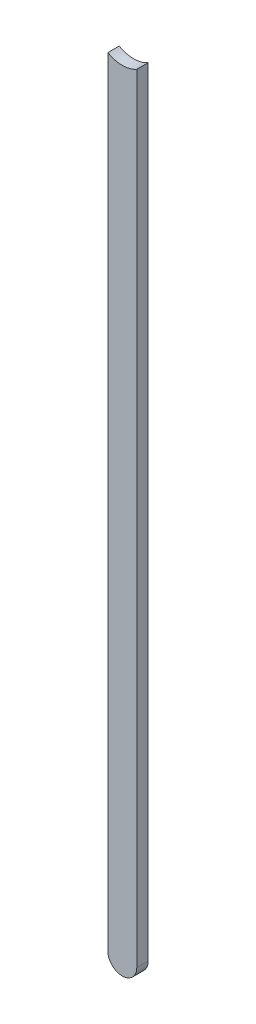
ISO-10303-21;
HEADER;
FILE_DESCRIPTION(('STEP AP214'),'2;1');
FILE_NAME('part.step','',(''),(''),'','','');
FILE_SCHEMA(('AUTOMOTIVE_DESIGN { 1 0 10303 214 1 1 1 1 }'));
ENDSEC;
DATA;
#1=APPLICATION_CONTEXT('core data for automotive mechanical design processes');
#2=APPLICATION_PROTOCOL_DEFINITION('international standard','automotive_design',2000,#1);
#3=PRODUCT_CONTEXT('',#1,'mechanical');
#4=PRODUCT('Part','Part','',(#3));
#5=PRODUCT_RELATED_PRODUCT_CATEGORY('part','',(#4));
#6=PRODUCT_DEFINITION_FORMATION('','',#4);
#7=PRODUCT_DEFINITION_CONTEXT('part definition',#1,'design');
#8=PRODUCT_DEFINITION('design','',#6,#7);
#9=PRODUCT_DEFINITION_SHAPE('','',#8);
#10=(LENGTH_UNIT() NAMED_UNIT(*) SI_UNIT(.MILLI.,.METRE.));
#11=(NAMED_UNIT(*) PLANE_ANGLE_UNIT() SI_UNIT($,.RADIAN.));
#12=(NAMED_UNIT(*) SI_UNIT($,.STERADIAN.) SOLID_ANGLE_UNIT());
#13=UNCERTAINTY_MEASURE_WITH_UNIT(LENGTH_MEASURE(1.E-05),#10,'distance_accuracy_value','');
#14=(GEOMETRIC_REPRESENTATION_CONTEXT(3) GLOBAL_UNCERTAINTY_ASSIGNED_CONTEXT((#13)) GLOBAL_UNIT_ASSIGNED_CONTEXT((#10,
#11,#12)) REPRESENTATION_CONTEXT('',''));
#15=CARTESIAN_POINT('',(0.,0.,0.));
#16=DIRECTION('',(0.,0.,1.));
#17=DIRECTION('',(1.,0.,0.));
#18=AXIS2_PLACEMENT_3D('',#15,#16,#17);
#19=CARTESIAN_POINT('',(99.441,103.8830028,0.));
#20=DIRECTION('',(-1.,0.,0.));
#21=DIRECTION('',(0.,1.,0.));
#22=AXIS2_PLACEMENT_3D('',#19,#20,#21);
#23=PLANE('',#22);
#24=DIRECTION('',(0.,1.,0.));
#25=VECTOR('',#24,1.);
#26=CARTESIAN_POINT('',(99.441,103.8830028,0.1999996));
#27=LINE('',#26,#25);
#28=CARTESIAN_POINT('',(99.441,103.8830028,0.1999996));
#29=VERTEX_POINT('',#28);
#30=CARTESIAN_POINT('',(99.441,117.543059094878,0.1999996));
#31=VERTEX_POINT('',#30);
#32=EDGE_CURVE('E11',#29,#31,#27,.T.);
#33=ORIENTED_EDGE('',*,*,#32,.F.);
#34=DIRECTION('',(0.,0.,1.));
#35=VECTOR('',#34,1.);
#36=CARTESIAN_POINT('',(99.441,103.8830028,0.));
#37=LINE('',#36,#35);
#38=CARTESIAN_POINT('',(99.441,103.8830028,0.));
#39=VERTEX_POINT('',#38);
#40=EDGE_CURVE('E24',#39,#29,#37,.T.);
#41=ORIENTED_EDGE('',*,*,#40,.F.);
#42=DIRECTION('',(0.,1.,0.));
#43=VECTOR('',#42,1.);
#44=CARTESIAN_POINT('',(99.441,103.8830028,0.));
#45=LINE('',#44,#43);
#46=CARTESIAN_POINT('',(99.441,117.543059094878,0.));
#47=VERTEX_POINT('',#46);
#48=EDGE_CURVE('E75',#39,#47,#45,.T.);
#49=ORIENTED_EDGE('',*,*,#48,.T.);
#50=DIRECTION('',(0.,0.,1.));
#51=VECTOR('',#50,1.);
#52=CARTESIAN_POINT('',(99.441,117.543059094878,0.));
#53=LINE('',#52,#51);
#54=EDGE_CURVE('E37',#47,#31,#53,.T.);
#55=ORIENTED_EDGE('',*,*,#54,.T.);
#56=EDGE_LOOP('',(#33,#41,#49,#55));
#57=FACE_BOUND('',#56,.T.);
#58=ADVANCED_FACE('F17',(#57),#23,.F.);
#59=CARTESIAN_POINT('',(99.187,117.983,0.));
#60=DIRECTION('',(0.,0.,-1.));
#61=DIRECTION('',(1.,0.,0.));
#62=AXIS2_PLACEMENT_3D('',#59,#60,#61);
#63=CYLINDRICAL_SURFACE('',#62,0.508);
#64=DIRECTION('',(0.,0.,1.));
#65=VECTOR('',#64,1.);
#66=CARTESIAN_POINT('',(98.933,117.543059094878,0.));
#67=LINE('',#66,#65);
#68=CARTESIAN_POINT('',(98.933,117.543059094878,0.));
#69=VERTEX_POINT('',#68);
#70=CARTESIAN_POINT('',(98.933,117.543059094878,0.1999996));
#71=VERTEX_POINT('',#70);
#72=EDGE_CURVE('E67',#69,#71,#67,.T.);
#73=ORIENTED_EDGE('',*,*,#72,.T.);
#74=CARTESIAN_POINT('',(99.187,117.983,0.1999996));
#75=DIRECTION('',(0.,0.,1.));
#76=DIRECTION('',(1.,0.,0.));
#77=AXIS2_PLACEMENT_3D('',#74,#75,#76);
#78=CIRCLE('',#77,0.508);
#79=EDGE_CURVE('E82',#71,#31,#78,.T.);
#80=ORIENTED_EDGE('',*,*,#79,.T.);
#81=ORIENTED_EDGE('',*,*,#54,.F.);
#82=CARTESIAN_POINT('',(99.187,117.983,0.));
#83=DIRECTION('',(0.,0.,1.));
#84=DIRECTION('',(1.,0.,0.));
#85=AXIS2_PLACEMENT_3D('',#82,#83,#84);
#86=CIRCLE('',#85,0.508);
#87=EDGE_CURVE('E80',#69,#47,#86,.T.);
#88=ORIENTED_EDGE('',*,*,#87,.F.);
#89=EDGE_LOOP('',(#73,#80,#81,#88));
#90=FACE_BOUND('',#89,.T.);
#91=ADVANCED_FACE('F88',(#90),#63,.F.);
#92=CARTESIAN_POINT('',(98.933,117.543059094878,0.));
#93=DIRECTION('',(1.,0.,0.));
#94=DIRECTION('',(0.,-1.,0.));
#95=AXIS2_PLACEMENT_3D('',#92,#93,#94);
#96=PLANE('',#95);
#97=DIRECTION('',(0.,-1.,0.));
#98=VECTOR('',#97,1.);
#99=CARTESIAN_POINT('',(98.933,117.983,0.1999996));
#100=LINE('',#99,#98);
#101=CARTESIAN_POINT('',(98.933,103.8830028,0.1999996));
#102=VERTEX_POINT('',#101);
#103=EDGE_CURVE('E71',#71,#102,#100,.T.);
#104=ORIENTED_EDGE('',*,*,#103,.F.);
#105=ORIENTED_EDGE('',*,*,#72,.F.);
#106=DIRECTION('',(0.,-1.,0.));
#107=VECTOR('',#106,1.);
#108=CARTESIAN_POINT('',(98.933,117.983,0.));
#109=LINE('',#108,#107);
#110=CARTESIAN_POINT('',(98.933,103.8830028,0.));
#111=VERTEX_POINT('',#110);
#112=EDGE_CURVE('E63',#69,#111,#109,.T.);
#113=ORIENTED_EDGE('',*,*,#112,.T.);
#114=DIRECTION('',(0.,0.,1.));
#115=VECTOR('',#114,1.);
#116=CARTESIAN_POINT('',(98.933,103.8830028,0.));
#117=LINE('',#116,#115);
#118=EDGE_CURVE('E53',#111,#102,#117,.T.);
#119=ORIENTED_EDGE('',*,*,#118,.T.);
#120=EDGE_LOOP('',(#104,#105,#113,#119));
#121=FACE_BOUND('',#120,.T.);
#122=ADVANCED_FACE('F66',(#121),#96,.F.);
#123=CARTESIAN_POINT('',(99.187,103.8830028,0.));
#124=DIRECTION('',(0.,0.,-1.));
#125=DIRECTION('',(-1.,0.,0.));
#126=AXIS2_PLACEMENT_3D('',#123,#124,#125);
#127=CYLINDRICAL_SURFACE('',#126,0.254);
#128=CARTESIAN_POINT('',(99.187,103.8830028,0.1999996));
#129=DIRECTION('',(0.,0.,1.));
#130=DIRECTION('',(-1.,0.,0.));
#131=AXIS2_PLACEMENT_3D('',#128,#129,#130);
#132=CIRCLE('',#131,0.254);
#133=EDGE_CURVE('E59',#102,#29,#132,.T.);
#134=ORIENTED_EDGE('',*,*,#133,.F.);
#135=ORIENTED_EDGE('',*,*,#118,.F.);
#136=CARTESIAN_POINT('',(99.187,103.8830028,0.));
#137=DIRECTION('',(0.,0.,1.));
#138=DIRECTION('',(-1.,0.,0.));
#139=AXIS2_PLACEMENT_3D('',#136,#137,#138);
#140=CIRCLE('',#139,0.254);
#141=EDGE_CURVE('E57',#111,#39,#140,.T.);
#142=ORIENTED_EDGE('',*,*,#141,.T.);
#143=ORIENTED_EDGE('',*,*,#40,.T.);
#144=EDGE_LOOP('',(#134,#135,#142,#143));
#145=FACE_BOUND('',#144,.T.);
#146=ADVANCED_FACE('F55',(#145),#127,.T.);
#147=CARTESIAN_POINT('',(99.441,103.8830028,0.));
#148=DIRECTION('',(0.,0.,-1.));
#149=DIRECTION('',(-1.,0.,0.));
#150=AXIS2_PLACEMENT_3D('',#147,#148,#149);
#151=PLANE('',#150);
#152=ORIENTED_EDGE('',*,*,#48,.F.);
#153=ORIENTED_EDGE('',*,*,#141,.F.);
#154=ORIENTED_EDGE('',*,*,#112,.F.);
#155=ORIENTED_EDGE('',*,*,#87,.T.);
#156=EDGE_LOOP('',(#152,#153,#154,#155));
#157=FACE_BOUND('',#156,.T.);
#158=ADVANCED_FACE('F74',(#157),#151,.T.);
#159=CARTESIAN_POINT('',(99.441,103.8830028,0.1999996));
#160=DIRECTION('',(0.,0.,-1.));
#161=DIRECTION('',(-1.,0.,0.));
#162=AXIS2_PLACEMENT_3D('',#159,#160,#161);
#163=PLANE('',#162);
#164=ORIENTED_EDGE('',*,*,#133,.T.);
#165=ORIENTED_EDGE('',*,*,#32,.T.);
#166=ORIENTED_EDGE('',*,*,#79,.F.);
#167=ORIENTED_EDGE('',*,*,#103,.T.);
#168=EDGE_LOOP('',(#164,#165,#166,#167));
#169=FACE_BOUND('',#168,.T.);
#170=ADVANCED_FACE('F91',(#169),#163,.F.);
#171=CLOSED_SHELL('',(#58,#91,#122,#146,#158,#170));
#172=MANIFOLD_SOLID_BREP('B1',#171);
#173=ADVANCED_BREP_SHAPE_REPRESENTATION('',(#18,#172),#14);
#174=SHAPE_DEFINITION_REPRESENTATION(#9,#173);
ENDSEC;
END-ISO-10303-21;
